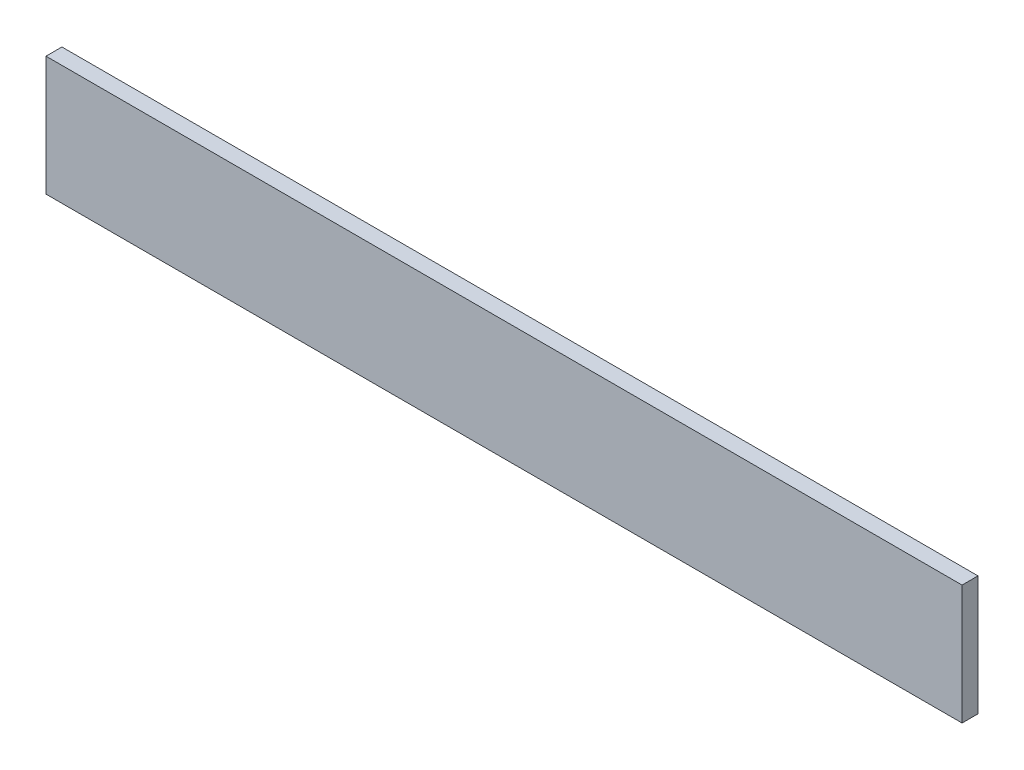
ISO-10303-21;
HEADER;
FILE_DESCRIPTION(('STEP AP214'),'2;1');
FILE_NAME('part.step','',(''),(''),'','','');
FILE_SCHEMA(('AUTOMOTIVE_DESIGN { 1 0 10303 214 1 1 1 1 }'));
ENDSEC;
DATA;
#1=APPLICATION_CONTEXT('core data for automotive mechanical design processes');
#2=APPLICATION_PROTOCOL_DEFINITION('international standard','automotive_design',2000,#1);
#3=PRODUCT_CONTEXT('',#1,'mechanical');
#4=PRODUCT('Part','Part','',(#3));
#5=PRODUCT_RELATED_PRODUCT_CATEGORY('part','',(#4));
#6=PRODUCT_DEFINITION_FORMATION('','',#4);
#7=PRODUCT_DEFINITION_CONTEXT('part definition',#1,'design');
#8=PRODUCT_DEFINITION('design','',#6,#7);
#9=PRODUCT_DEFINITION_SHAPE('','',#8);
#10=(LENGTH_UNIT() NAMED_UNIT(*) SI_UNIT(.MILLI.,.METRE.));
#11=(NAMED_UNIT(*) PLANE_ANGLE_UNIT() SI_UNIT($,.RADIAN.));
#12=(NAMED_UNIT(*) SI_UNIT($,.STERADIAN.) SOLID_ANGLE_UNIT());
#13=UNCERTAINTY_MEASURE_WITH_UNIT(LENGTH_MEASURE(1.E-05),#10,'distance_accuracy_value','');
#14=(GEOMETRIC_REPRESENTATION_CONTEXT(3) GLOBAL_UNCERTAINTY_ASSIGNED_CONTEXT((#13)) GLOBAL_UNIT_ASSIGNED_CONTEXT((#10,
#11,#12)) REPRESENTATION_CONTEXT('',''));
#15=CARTESIAN_POINT('',(0.,0.,0.));
#16=DIRECTION('',(0.,0.,1.));
#17=DIRECTION('',(1.,0.,0.));
#18=AXIS2_PLACEMENT_3D('',#15,#16,#17);
#19=CARTESIAN_POINT('',(0.,0.,4.));
#20=DIRECTION('',(1.,0.,0.));
#21=DIRECTION('',(0.,0.,-1.));
#22=AXIS2_PLACEMENT_3D('',#19,#20,#21);
#23=PLANE('',#22);
#24=DIRECTION('',(0.,-1.,0.));
#25=VECTOR('',#24,1.);
#26=CARTESIAN_POINT('',(0.,0.,0.));
#27=LINE('',#26,#25);
#28=CARTESIAN_POINT('',(0.,30.,0.));
#29=VERTEX_POINT('',#28);
#30=CARTESIAN_POINT('',(0.,0.,0.));
#31=VERTEX_POINT('',#30);
#32=EDGE_CURVE('E111',#29,#31,#27,.T.);
#33=ORIENTED_EDGE('',*,*,#32,.T.);
#34=DIRECTION('',(0.,0.,-1.));
#35=VECTOR('',#34,1.);
#36=CARTESIAN_POINT('',(0.,0.,4.));
#37=LINE('',#36,#35);
#38=CARTESIAN_POINT('',(0.,0.,4.));
#39=VERTEX_POINT('',#38);
#40=EDGE_CURVE('E11',#39,#31,#37,.T.);
#41=ORIENTED_EDGE('',*,*,#40,.F.);
#42=DIRECTION('',(0.,-1.,0.));
#43=VECTOR('',#42,1.);
#44=CARTESIAN_POINT('',(0.,0.,4.));
#45=LINE('',#44,#43);
#46=CARTESIAN_POINT('',(0.,30.,4.));
#47=VERTEX_POINT('',#46);
#48=EDGE_CURVE('E100',#47,#39,#45,.T.);
#49=ORIENTED_EDGE('',*,*,#48,.F.);
#50=DIRECTION('',(0.,0.,-1.));
#51=VECTOR('',#50,1.);
#52=CARTESIAN_POINT('',(0.,30.,4.));
#53=LINE('',#52,#51);
#54=EDGE_CURVE('E108',#47,#29,#53,.T.);
#55=ORIENTED_EDGE('',*,*,#54,.T.);
#56=EDGE_LOOP('',(#33,#41,#49,#55));
#57=FACE_BOUND('',#56,.T.);
#58=ADVANCED_FACE('F44',(#57),#23,.F.);
#59=CARTESIAN_POINT('',(0.,0.,4.));
#60=DIRECTION('',(0.,1.,0.));
#61=DIRECTION('',(0.,0.,1.));
#62=AXIS2_PLACEMENT_3D('',#59,#60,#61);
#63=PLANE('',#62);
#64=DIRECTION('',(1.,0.,0.));
#65=VECTOR('',#64,1.);
#66=CARTESIAN_POINT('',(0.,0.,0.));
#67=LINE('',#66,#65);
#68=CARTESIAN_POINT('',(230.,0.,0.));
#69=VERTEX_POINT('',#68);
#70=EDGE_CURVE('E105',#31,#69,#67,.T.);
#71=ORIENTED_EDGE('',*,*,#70,.T.);
#72=DIRECTION('',(0.,0.,-1.));
#73=VECTOR('',#72,1.);
#74=CARTESIAN_POINT('',(230.,0.,4.));
#75=LINE('',#74,#73);
#76=CARTESIAN_POINT('',(230.,0.,4.));
#77=VERTEX_POINT('',#76);
#78=EDGE_CURVE('E53',#77,#69,#75,.T.);
#79=ORIENTED_EDGE('',*,*,#78,.F.);
#80=DIRECTION('',(1.,0.,0.));
#81=VECTOR('',#80,1.);
#82=CARTESIAN_POINT('',(0.,0.,4.));
#83=LINE('',#82,#81);
#84=EDGE_CURVE('E95',#39,#77,#83,.T.);
#85=ORIENTED_EDGE('',*,*,#84,.F.);
#86=ORIENTED_EDGE('',*,*,#40,.T.);
#87=EDGE_LOOP('',(#71,#79,#85,#86));
#88=FACE_BOUND('',#87,.T.);
#89=ADVANCED_FACE('F102',(#88),#63,.F.);
#90=CARTESIAN_POINT('',(230.,0.,4.));
#91=DIRECTION('',(-1.,0.,0.));
#92=DIRECTION('',(0.,0.,1.));
#93=AXIS2_PLACEMENT_3D('',#90,#91,#92);
#94=PLANE('',#93);
#95=DIRECTION('',(0.,1.,0.));
#96=VECTOR('',#95,1.);
#97=CARTESIAN_POINT('',(230.,0.,0.));
#98=LINE('',#97,#96);
#99=CARTESIAN_POINT('',(230.,30.,0.));
#100=VERTEX_POINT('',#99);
#101=EDGE_CURVE('E80',#69,#100,#98,.T.);
#102=ORIENTED_EDGE('',*,*,#101,.T.);
#103=DIRECTION('',(0.,0.,-1.));
#104=VECTOR('',#103,1.);
#105=CARTESIAN_POINT('',(230.,30.,4.));
#106=LINE('',#105,#104);
#107=CARTESIAN_POINT('',(230.,30.,4.));
#108=VERTEX_POINT('',#107);
#109=EDGE_CURVE('E101',#108,#100,#106,.T.);
#110=ORIENTED_EDGE('',*,*,#109,.F.);
#111=DIRECTION('',(0.,1.,0.));
#112=VECTOR('',#111,1.);
#113=CARTESIAN_POINT('',(230.,0.,4.));
#114=LINE('',#113,#112);
#115=EDGE_CURVE('E94',#77,#108,#114,.T.);
#116=ORIENTED_EDGE('',*,*,#115,.F.);
#117=ORIENTED_EDGE('',*,*,#78,.T.);
#118=EDGE_LOOP('',(#102,#110,#116,#117));
#119=FACE_BOUND('',#118,.T.);
#120=ADVANCED_FACE('F103',(#119),#94,.F.);
#121=CARTESIAN_POINT('',(230.,30.,4.));
#122=DIRECTION('',(0.,-1.,0.));
#123=DIRECTION('',(1.,0.,0.));
#124=AXIS2_PLACEMENT_3D('',#121,#122,#123);
#125=PLANE('',#124);
#126=DIRECTION('',(-1.,0.,0.));
#127=VECTOR('',#126,1.);
#128=CARTESIAN_POINT('',(230.,30.,0.));
#129=LINE('',#128,#127);
#130=EDGE_CURVE('E82',#100,#29,#129,.T.);
#131=ORIENTED_EDGE('',*,*,#130,.T.);
#132=ORIENTED_EDGE('',*,*,#54,.F.);
#133=DIRECTION('',(-1.,0.,0.));
#134=VECTOR('',#133,1.);
#135=CARTESIAN_POINT('',(230.,30.,4.));
#136=LINE('',#135,#134);
#137=EDGE_CURVE('E62',#108,#47,#136,.T.);
#138=ORIENTED_EDGE('',*,*,#137,.F.);
#139=ORIENTED_EDGE('',*,*,#109,.T.);
#140=EDGE_LOOP('',(#131,#132,#138,#139));
#141=FACE_BOUND('',#140,.T.);
#142=ADVANCED_FACE('F128',(#141),#125,.F.);
#143=CARTESIAN_POINT('',(0.,0.,4.));
#144=DIRECTION('',(0.,0.,1.));
#145=DIRECTION('',(1.,0.,0.));
#146=AXIS2_PLACEMENT_3D('',#143,#144,#145);
#147=PLANE('',#146);
#148=ORIENTED_EDGE('',*,*,#48,.T.);
#149=ORIENTED_EDGE('',*,*,#84,.T.);
#150=ORIENTED_EDGE('',*,*,#115,.T.);
#151=ORIENTED_EDGE('',*,*,#137,.T.);
#152=EDGE_LOOP('',(#148,#149,#150,#151));
#153=FACE_BOUND('',#152,.T.);
#154=ADVANCED_FACE('F93',(#153),#147,.T.);
#155=CARTESIAN_POINT('',(0.,0.,0.));
#156=DIRECTION('',(0.,0.,1.));
#157=DIRECTION('',(1.,0.,0.));
#158=AXIS2_PLACEMENT_3D('',#155,#156,#157);
#159=PLANE('',#158);
#160=ORIENTED_EDGE('',*,*,#32,.F.);
#161=ORIENTED_EDGE('',*,*,#130,.F.);
#162=ORIENTED_EDGE('',*,*,#101,.F.);
#163=ORIENTED_EDGE('',*,*,#70,.F.);
#164=EDGE_LOOP('',(#160,#161,#162,#163));
#165=FACE_BOUND('',#164,.T.);
#166=ADVANCED_FACE('F129',(#165),#159,.F.);
#167=CLOSED_SHELL('',(#58,#89,#120,#142,#154,#166));
#168=MANIFOLD_SOLID_BREP('B2',#167);
#169=ADVANCED_BREP_SHAPE_REPRESENTATION('',(#18,#168),#14);
#170=SHAPE_DEFINITION_REPRESENTATION(#9,#169);
ENDSEC;
END-ISO-10303-21;
